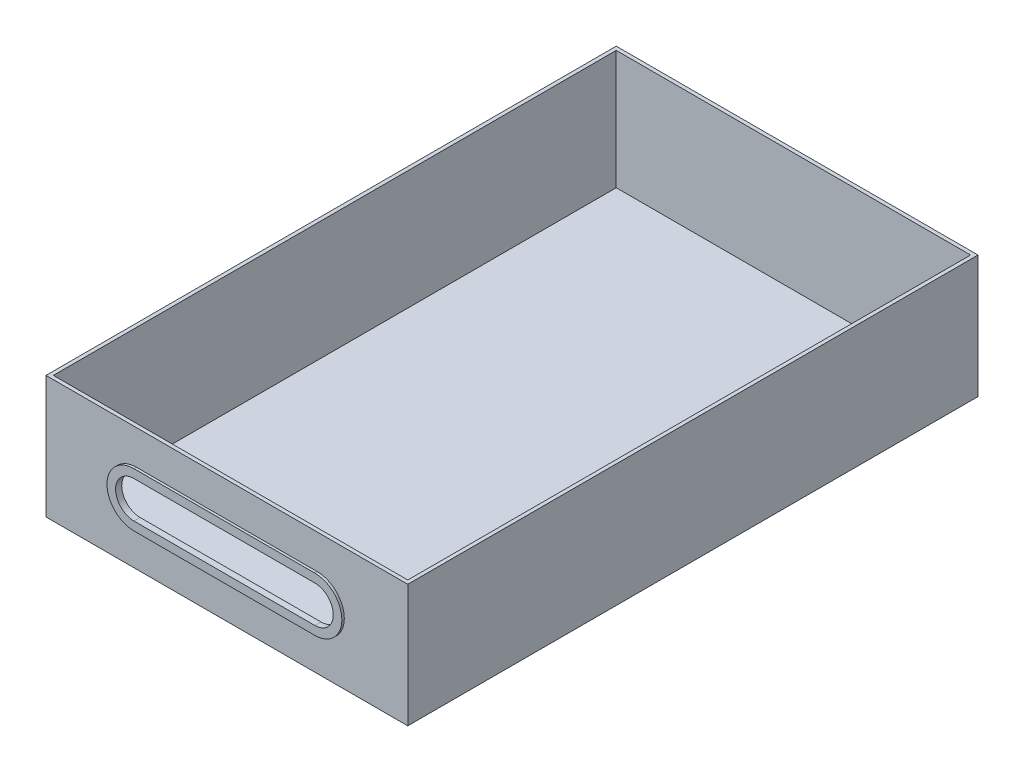
ISO-10303-21;
HEADER;
FILE_DESCRIPTION(('STEP AP214'),'2;1');
FILE_NAME('part.step','',(''),(''),'','','');
FILE_SCHEMA(('AUTOMOTIVE_DESIGN { 1 0 10303 214 1 1 1 1 }'));
ENDSEC;
DATA;
#1=APPLICATION_CONTEXT('core data for automotive mechanical design processes');
#2=APPLICATION_PROTOCOL_DEFINITION('international standard','automotive_design',2000,#1);
#3=PRODUCT_CONTEXT('',#1,'mechanical');
#4=PRODUCT('Part','Part','',(#3));
#5=PRODUCT_RELATED_PRODUCT_CATEGORY('part','',(#4));
#6=PRODUCT_DEFINITION_FORMATION('','',#4);
#7=PRODUCT_DEFINITION_CONTEXT('part definition',#1,'design');
#8=PRODUCT_DEFINITION('design','',#6,#7);
#9=PRODUCT_DEFINITION_SHAPE('','',#8);
#10=(LENGTH_UNIT() NAMED_UNIT(*) SI_UNIT(.MILLI.,.METRE.));
#11=(NAMED_UNIT(*) PLANE_ANGLE_UNIT() SI_UNIT($,.RADIAN.));
#12=(NAMED_UNIT(*) SI_UNIT($,.STERADIAN.) SOLID_ANGLE_UNIT());
#13=UNCERTAINTY_MEASURE_WITH_UNIT(LENGTH_MEASURE(1.E-05),#10,'distance_accuracy_value','');
#14=(GEOMETRIC_REPRESENTATION_CONTEXT(3) GLOBAL_UNCERTAINTY_ASSIGNED_CONTEXT((#13)) GLOBAL_UNIT_ASSIGNED_CONTEXT((#10,
#11,#12)) REPRESENTATION_CONTEXT('',''));
#15=CARTESIAN_POINT('',(0.,0.,0.));
#16=DIRECTION('',(0.,0.,1.));
#17=DIRECTION('',(1.,0.,0.));
#18=AXIS2_PLACEMENT_3D('',#15,#16,#17);
#19=CARTESIAN_POINT('',(147.5,-100.,-232.5));
#20=DIRECTION('',(0.,0.,-1.));
#21=DIRECTION('',(-1.,0.,0.));
#22=AXIS2_PLACEMENT_3D('',#19,#20,#21);
#23=PLANE('',#22);
#24=DIRECTION('',(-1.,0.,0.));
#25=VECTOR('',#24,1.);
#26=CARTESIAN_POINT('',(147.5,0.,-232.5));
#27=LINE('',#26,#25);
#28=CARTESIAN_POINT('',(147.5,0.,-232.5));
#29=VERTEX_POINT('',#28);
#30=CARTESIAN_POINT('',(-147.5,0.,-232.5));
#31=VERTEX_POINT('',#30);
#32=EDGE_CURVE('E263',#29,#31,#27,.T.);
#33=ORIENTED_EDGE('',*,*,#32,.F.);
#34=DIRECTION('',(0.,1.,0.));
#35=VECTOR('',#34,1.);
#36=CARTESIAN_POINT('',(147.5,-100.,-232.5));
#37=LINE('',#36,#35);
#38=CARTESIAN_POINT('',(147.5,-100.,-232.5));
#39=VERTEX_POINT('',#38);
#40=EDGE_CURVE('E336',#39,#29,#37,.T.);
#41=ORIENTED_EDGE('',*,*,#40,.F.);
#42=DIRECTION('',(-1.,0.,0.));
#43=VECTOR('',#42,1.);
#44=CARTESIAN_POINT('',(147.5,-100.,-232.5));
#45=LINE('',#44,#43);
#46=CARTESIAN_POINT('',(-147.5,-100.,-232.5));
#47=VERTEX_POINT('',#46);
#48=EDGE_CURVE('E304',#39,#47,#45,.T.);
#49=ORIENTED_EDGE('',*,*,#48,.T.);
#50=DIRECTION('',(0.,1.,0.));
#51=VECTOR('',#50,1.);
#52=CARTESIAN_POINT('',(-147.5,-100.,-232.5));
#53=LINE('',#52,#51);
#54=EDGE_CURVE('E321',#47,#31,#53,.T.);
#55=ORIENTED_EDGE('',*,*,#54,.T.);
#56=EDGE_LOOP('',(#33,#41,#49,#55));
#57=FACE_BOUND('',#56,.T.);
#58=ADVANCED_FACE('F69',(#57),#23,.T.);
#59=CARTESIAN_POINT('',(147.5,-100.,232.5));
#60=DIRECTION('',(1.,0.,0.));
#61=DIRECTION('',(0.,0.,-1.));
#62=AXIS2_PLACEMENT_3D('',#59,#60,#61);
#63=PLANE('',#62);
#64=DIRECTION('',(0.,0.,-1.));
#65=VECTOR('',#64,1.);
#66=CARTESIAN_POINT('',(147.5,0.,232.5));
#67=LINE('',#66,#65);
#68=CARTESIAN_POINT('',(147.5,0.,232.5));
#69=VERTEX_POINT('',#68);
#70=EDGE_CURVE('E309',#69,#29,#67,.T.);
#71=ORIENTED_EDGE('',*,*,#70,.F.);
#72=DIRECTION('',(0.,1.,0.));
#73=VECTOR('',#72,1.);
#74=CARTESIAN_POINT('',(147.5,-100.,232.5));
#75=LINE('',#74,#73);
#76=CARTESIAN_POINT('',(147.5,-100.,232.5));
#77=VERTEX_POINT('',#76);
#78=EDGE_CURVE('E340',#77,#69,#75,.T.);
#79=ORIENTED_EDGE('',*,*,#78,.F.);
#80=DIRECTION('',(0.,0.,-1.));
#81=VECTOR('',#80,1.);
#82=CARTESIAN_POINT('',(147.5,-100.,232.5));
#83=LINE('',#82,#81);
#84=EDGE_CURVE('E317',#77,#39,#83,.T.);
#85=ORIENTED_EDGE('',*,*,#84,.T.);
#86=ORIENTED_EDGE('',*,*,#40,.T.);
#87=EDGE_LOOP('',(#71,#79,#85,#86));
#88=FACE_BOUND('',#87,.T.);
#89=ADVANCED_FACE('F371',(#88),#63,.T.);
#90=CARTESIAN_POINT('',(-147.5,-100.,232.5));
#91=DIRECTION('',(0.,0.,1.));
#92=DIRECTION('',(1.,0.,0.));
#93=AXIS2_PLACEMENT_3D('',#90,#91,#92);
#94=PLANE('',#93);
#95=DIRECTION('',(1.,0.,0.));
#96=VECTOR('',#95,1.);
#97=CARTESIAN_POINT('',(-73.7500000000001,-28.,232.5));
#98=LINE('',#97,#96);
#99=CARTESIAN_POINT('',(-73.7500000000001,-28.,232.5));
#100=VERTEX_POINT('',#99);
#101=CARTESIAN_POINT('',(73.7499999999999,-28.,232.5));
#102=VERTEX_POINT('',#101);
#103=EDGE_CURVE('E215',#100,#102,#98,.T.);
#104=ORIENTED_EDGE('',*,*,#103,.T.);
#105=CARTESIAN_POINT('',(73.7499999999999,-50.,232.5));
#106=DIRECTION('',(0.,0.,1.));
#107=DIRECTION('',(1.,0.,0.));
#108=AXIS2_PLACEMENT_3D('',#105,#106,#107);
#109=CIRCLE('',#108,22.);
#110=CARTESIAN_POINT('',(73.7499999999999,-72.,232.5));
#111=VERTEX_POINT('',#110);
#112=EDGE_CURVE('E234',#111,#102,#109,.T.);
#113=ORIENTED_EDGE('',*,*,#112,.F.);
#114=DIRECTION('',(1.,0.,0.));
#115=VECTOR('',#114,1.);
#116=CARTESIAN_POINT('',(-73.7500000000001,-72.,232.5));
#117=LINE('',#116,#115);
#118=CARTESIAN_POINT('',(-73.7500000000001,-72.,232.5));
#119=VERTEX_POINT('',#118);
#120=EDGE_CURVE('E237',#119,#111,#117,.T.);
#121=ORIENTED_EDGE('',*,*,#120,.F.);
#122=CARTESIAN_POINT('',(-73.7500000000001,-50.,232.5));
#123=DIRECTION('',(0.,0.,1.));
#124=DIRECTION('',(1.,0.,0.));
#125=AXIS2_PLACEMENT_3D('',#122,#123,#124);
#126=CIRCLE('',#125,22.);
#127=EDGE_CURVE('E221',#100,#119,#126,.T.);
#128=ORIENTED_EDGE('',*,*,#127,.F.);
#129=EDGE_LOOP('',(#104,#113,#121,#128));
#130=FACE_BOUND('',#129,.T.);
#131=DIRECTION('',(1.,0.,0.));
#132=VECTOR('',#131,1.);
#133=CARTESIAN_POINT('',(-147.5,0.,232.5));
#134=LINE('',#133,#132);
#135=CARTESIAN_POINT('',(-147.5,0.,232.5));
#136=VERTEX_POINT('',#135);
#137=EDGE_CURVE('E329',#136,#69,#134,.T.);
#138=ORIENTED_EDGE('',*,*,#137,.F.);
#139=DIRECTION('',(0.,1.,0.));
#140=VECTOR('',#139,1.);
#141=CARTESIAN_POINT('',(-147.5,-100.,232.5));
#142=LINE('',#141,#140);
#143=CARTESIAN_POINT('',(-147.5,-100.,232.5));
#144=VERTEX_POINT('',#143);
#145=EDGE_CURVE('E343',#144,#136,#142,.T.);
#146=ORIENTED_EDGE('',*,*,#145,.F.);
#147=DIRECTION('',(1.,0.,0.));
#148=VECTOR('',#147,1.);
#149=CARTESIAN_POINT('',(-147.5,-100.,232.5));
#150=LINE('',#149,#148);
#151=EDGE_CURVE('E313',#144,#77,#150,.T.);
#152=ORIENTED_EDGE('',*,*,#151,.T.);
#153=ORIENTED_EDGE('',*,*,#78,.T.);
#154=EDGE_LOOP('',(#138,#146,#152,#153));
#155=FACE_BOUND('',#154,.T.);
#156=ADVANCED_FACE('F376',(#130,#155),#94,.T.);
#157=CARTESIAN_POINT('',(-147.5,-100.,-232.5));
#158=DIRECTION('',(-1.,0.,0.));
#159=DIRECTION('',(0.,0.,1.));
#160=AXIS2_PLACEMENT_3D('',#157,#158,#159);
#161=PLANE('',#160);
#162=DIRECTION('',(0.,0.,1.));
#163=VECTOR('',#162,1.);
#164=CARTESIAN_POINT('',(-147.5,0.,-232.5));
#165=LINE('',#164,#163);
#166=EDGE_CURVE('E325',#31,#136,#165,.T.);
#167=ORIENTED_EDGE('',*,*,#166,.F.);
#168=ORIENTED_EDGE('',*,*,#54,.F.);
#169=DIRECTION('',(0.,0.,1.));
#170=VECTOR('',#169,1.);
#171=CARTESIAN_POINT('',(-147.5,-100.,-232.5));
#172=LINE('',#171,#170);
#173=EDGE_CURVE('E308',#47,#144,#172,.T.);
#174=ORIENTED_EDGE('',*,*,#173,.T.);
#175=ORIENTED_EDGE('',*,*,#145,.T.);
#176=EDGE_LOOP('',(#167,#168,#174,#175));
#177=FACE_BOUND('',#176,.T.);
#178=ADVANCED_FACE('F392',(#177),#161,.T.);
#179=CARTESIAN_POINT('',(0.,-100.,0.));
#180=DIRECTION('',(0.,1.,0.));
#181=DIRECTION('',(0.,0.,1.));
#182=AXIS2_PLACEMENT_3D('',#179,#180,#181);
#183=PLANE('',#182);
#184=ORIENTED_EDGE('',*,*,#48,.F.);
#185=ORIENTED_EDGE('',*,*,#84,.F.);
#186=ORIENTED_EDGE('',*,*,#151,.F.);
#187=ORIENTED_EDGE('',*,*,#173,.F.);
#188=EDGE_LOOP('',(#184,#185,#186,#187));
#189=FACE_BOUND('',#188,.T.);
#190=ADVANCED_FACE('F389',(#189),#183,.F.);
#191=CARTESIAN_POINT('',(0.,0.,0.));
#192=DIRECTION('',(0.,1.,0.));
#193=DIRECTION('',(0.,0.,1.));
#194=AXIS2_PLACEMENT_3D('',#191,#192,#193);
#195=PLANE('',#194);
#196=DIRECTION('',(-1.,0.,0.));
#197=VECTOR('',#196,1.);
#198=CARTESIAN_POINT('',(0.,0.,-229.5));
#199=LINE('',#198,#197);
#200=CARTESIAN_POINT('',(144.5,0.,-229.5));
#201=VERTEX_POINT('',#200);
#202=CARTESIAN_POINT('',(-144.5,0.,-229.5));
#203=VERTEX_POINT('',#202);
#204=EDGE_CURVE('E259',#201,#203,#199,.T.);
#205=ORIENTED_EDGE('',*,*,#204,.F.);
#206=DIRECTION('',(0.,0.,-1.));
#207=VECTOR('',#206,1.);
#208=CARTESIAN_POINT('',(144.5,0.,0.));
#209=LINE('',#208,#207);
#210=CARTESIAN_POINT('',(144.5,0.,229.5));
#211=VERTEX_POINT('',#210);
#212=EDGE_CURVE('E270',#211,#201,#209,.T.);
#213=ORIENTED_EDGE('',*,*,#212,.F.);
#214=DIRECTION('',(1.,0.,0.));
#215=VECTOR('',#214,1.);
#216=CARTESIAN_POINT('',(0.,0.,229.5));
#217=LINE('',#216,#215);
#218=CARTESIAN_POINT('',(-144.5,0.,229.5));
#219=VERTEX_POINT('',#218);
#220=EDGE_CURVE('E298',#219,#211,#217,.T.);
#221=ORIENTED_EDGE('',*,*,#220,.F.);
#222=DIRECTION('',(0.,0.,1.));
#223=VECTOR('',#222,1.);
#224=CARTESIAN_POINT('',(-144.5,0.,0.));
#225=LINE('',#224,#223);
#226=EDGE_CURVE('E294',#203,#219,#225,.T.);
#227=ORIENTED_EDGE('',*,*,#226,.F.);
#228=EDGE_LOOP('',(#205,#213,#221,#227));
#229=FACE_BOUND('',#228,.T.);
#230=ORIENTED_EDGE('',*,*,#32,.T.);
#231=ORIENTED_EDGE('',*,*,#166,.T.);
#232=ORIENTED_EDGE('',*,*,#137,.T.);
#233=ORIENTED_EDGE('',*,*,#70,.T.);
#234=EDGE_LOOP('',(#230,#231,#232,#233));
#235=FACE_BOUND('',#234,.T.);
#236=ADVANCED_FACE('F384',(#229,#235),#195,.T.);
#237=CARTESIAN_POINT('',(147.5,-100.,-229.5));
#238=DIRECTION('',(0.,0.,-1.));
#239=DIRECTION('',(-1.,0.,0.));
#240=AXIS2_PLACEMENT_3D('',#237,#238,#239);
#241=PLANE('',#240);
#242=ORIENTED_EDGE('',*,*,#204,.T.);
#243=DIRECTION('',(0.,1.,0.));
#244=VECTOR('',#243,1.);
#245=CARTESIAN_POINT('',(-144.5,-100.,-229.5));
#246=LINE('',#245,#244);
#247=CARTESIAN_POINT('',(-144.5,-97.,-229.5));
#248=VERTEX_POINT('',#247);
#249=EDGE_CURVE('E271',#248,#203,#246,.T.);
#250=ORIENTED_EDGE('',*,*,#249,.F.);
#251=DIRECTION('',(-1.,0.,0.));
#252=VECTOR('',#251,1.);
#253=CARTESIAN_POINT('',(0.,-97.,-229.5));
#254=LINE('',#253,#252);
#255=CARTESIAN_POINT('',(144.5,-97.,-229.5));
#256=VERTEX_POINT('',#255);
#257=EDGE_CURVE('E265',#256,#248,#254,.T.);
#258=ORIENTED_EDGE('',*,*,#257,.F.);
#259=DIRECTION('',(0.,1.,0.));
#260=VECTOR('',#259,1.);
#261=CARTESIAN_POINT('',(144.5,-100.,-229.5));
#262=LINE('',#261,#260);
#263=EDGE_CURVE('E260',#256,#201,#262,.T.);
#264=ORIENTED_EDGE('',*,*,#263,.T.);
#265=EDGE_LOOP('',(#242,#250,#258,#264));
#266=FACE_BOUND('',#265,.T.);
#267=ADVANCED_FACE('F403',(#266),#241,.F.);
#268=CARTESIAN_POINT('',(144.5,-100.,232.5));
#269=DIRECTION('',(1.,0.,0.));
#270=DIRECTION('',(0.,0.,-1.));
#271=AXIS2_PLACEMENT_3D('',#268,#269,#270);
#272=PLANE('',#271);
#273=ORIENTED_EDGE('',*,*,#212,.T.);
#274=ORIENTED_EDGE('',*,*,#263,.F.);
#275=DIRECTION('',(0.,0.,-1.));
#276=VECTOR('',#275,1.);
#277=CARTESIAN_POINT('',(144.5,-97.,0.));
#278=LINE('',#277,#276);
#279=CARTESIAN_POINT('',(144.5,-97.,229.5));
#280=VERTEX_POINT('',#279);
#281=EDGE_CURVE('E275',#280,#256,#278,.T.);
#282=ORIENTED_EDGE('',*,*,#281,.F.);
#283=DIRECTION('',(0.,1.,0.));
#284=VECTOR('',#283,1.);
#285=CARTESIAN_POINT('',(144.5,-100.,229.5));
#286=LINE('',#285,#284);
#287=EDGE_CURVE('E264',#280,#211,#286,.T.);
#288=ORIENTED_EDGE('',*,*,#287,.T.);
#289=EDGE_LOOP('',(#273,#274,#282,#288));
#290=FACE_BOUND('',#289,.T.);
#291=ADVANCED_FACE('F417',(#290),#272,.F.);
#292=CARTESIAN_POINT('',(-147.5,-100.,229.5));
#293=DIRECTION('',(0.,0.,1.));
#294=DIRECTION('',(1.,0.,0.));
#295=AXIS2_PLACEMENT_3D('',#292,#293,#294);
#296=PLANE('',#295);
#297=CARTESIAN_POINT('',(-73.7500000000001,-50.,229.5));
#298=DIRECTION('',(0.,0.,1.));
#299=DIRECTION('',(1.,0.,0.));
#300=AXIS2_PLACEMENT_3D('',#297,#298,#299);
#301=CIRCLE('',#300,15.);
#302=CARTESIAN_POINT('',(-73.7500000000001,-35.,229.5));
#303=VERTEX_POINT('',#302);
#304=CARTESIAN_POINT('',(-73.7500000000001,-65.,229.5));
#305=VERTEX_POINT('',#304);
#306=EDGE_CURVE('E339',#303,#305,#301,.T.);
#307=ORIENTED_EDGE('',*,*,#306,.T.);
#308=DIRECTION('',(1.,0.,0.));
#309=VECTOR('',#308,1.);
#310=CARTESIAN_POINT('',(-147.5,-65.,229.5));
#311=LINE('',#310,#309);
#312=CARTESIAN_POINT('',(73.7499999999999,-65.,229.5));
#313=VERTEX_POINT('',#312);
#314=EDGE_CURVE('E12',#305,#313,#311,.T.);
#315=ORIENTED_EDGE('',*,*,#314,.T.);
#316=CARTESIAN_POINT('',(73.7499999999999,-50.,229.5));
#317=DIRECTION('',(0.,0.,1.));
#318=DIRECTION('',(1.,0.,0.));
#319=AXIS2_PLACEMENT_3D('',#316,#317,#318);
#320=CIRCLE('',#319,15.);
#321=CARTESIAN_POINT('',(73.7499999999999,-35.,229.5));
#322=VERTEX_POINT('',#321);
#323=EDGE_CURVE('E77',#313,#322,#320,.T.);
#324=ORIENTED_EDGE('',*,*,#323,.T.);
#325=DIRECTION('',(1.,0.,0.));
#326=VECTOR('',#325,1.);
#327=CARTESIAN_POINT('',(-147.5,-35.,229.5));
#328=LINE('',#327,#326);
#329=EDGE_CURVE('E351',#303,#322,#328,.T.);
#330=ORIENTED_EDGE('',*,*,#329,.F.);
#331=EDGE_LOOP('',(#307,#315,#324,#330));
#332=FACE_BOUND('',#331,.T.);
#333=ORIENTED_EDGE('',*,*,#220,.T.);
#334=ORIENTED_EDGE('',*,*,#287,.F.);
#335=DIRECTION('',(1.,0.,0.));
#336=VECTOR('',#335,1.);
#337=CARTESIAN_POINT('',(0.,-97.,229.5));
#338=LINE('',#337,#336);
#339=CARTESIAN_POINT('',(-144.5,-97.,229.5));
#340=VERTEX_POINT('',#339);
#341=EDGE_CURVE('E282',#340,#280,#338,.T.);
#342=ORIENTED_EDGE('',*,*,#341,.F.);
#343=DIRECTION('',(0.,1.,0.));
#344=VECTOR('',#343,1.);
#345=CARTESIAN_POINT('',(-144.5,-100.,229.5));
#346=LINE('',#345,#344);
#347=EDGE_CURVE('E274',#340,#219,#346,.T.);
#348=ORIENTED_EDGE('',*,*,#347,.T.);
#349=EDGE_LOOP('',(#333,#334,#342,#348));
#350=FACE_BOUND('',#349,.T.);
#351=ADVANCED_FACE('F356',(#332,#350),#296,.F.);
#352=CARTESIAN_POINT('',(-144.5,-100.,-232.5));
#353=DIRECTION('',(-1.,0.,0.));
#354=DIRECTION('',(0.,0.,1.));
#355=AXIS2_PLACEMENT_3D('',#352,#353,#354);
#356=PLANE('',#355);
#357=ORIENTED_EDGE('',*,*,#226,.T.);
#358=ORIENTED_EDGE('',*,*,#347,.F.);
#359=DIRECTION('',(0.,0.,1.));
#360=VECTOR('',#359,1.);
#361=CARTESIAN_POINT('',(-144.5,-97.,0.));
#362=LINE('',#361,#360);
#363=EDGE_CURVE('E269',#248,#340,#362,.T.);
#364=ORIENTED_EDGE('',*,*,#363,.F.);
#365=ORIENTED_EDGE('',*,*,#249,.T.);
#366=EDGE_LOOP('',(#357,#358,#364,#365));
#367=FACE_BOUND('',#366,.T.);
#368=ADVANCED_FACE('F410',(#367),#356,.F.);
#369=CARTESIAN_POINT('',(0.,-97.,0.));
#370=DIRECTION('',(0.,1.,0.));
#371=DIRECTION('',(0.,0.,1.));
#372=AXIS2_PLACEMENT_3D('',#369,#370,#371);
#373=PLANE('',#372);
#374=ORIENTED_EDGE('',*,*,#257,.T.);
#375=ORIENTED_EDGE('',*,*,#363,.T.);
#376=ORIENTED_EDGE('',*,*,#341,.T.);
#377=ORIENTED_EDGE('',*,*,#281,.T.);
#378=EDGE_LOOP('',(#374,#375,#376,#377));
#379=FACE_BOUND('',#378,.T.);
#380=ADVANCED_FACE('F407',(#379),#373,.T.);
#381=CARTESIAN_POINT('',(-73.7500000000001,-65.,-409.517360273947));
#382=DIRECTION('',(0.,-1.,0.));
#383=DIRECTION('',(0.,0.,-1.));
#384=AXIS2_PLACEMENT_3D('',#381,#382,#383);
#385=PLANE('',#384);
#386=DIRECTION('',(0.,0.,1.));
#387=VECTOR('',#386,1.);
#388=CARTESIAN_POINT('',(-73.7500000000001,-65.,-409.517360273947));
#389=LINE('',#388,#387);
#390=CARTESIAN_POINT('',(-73.7500000000001,-65.,234.5));
#391=VERTEX_POINT('',#390);
#392=EDGE_CURVE('E92',#305,#391,#389,.T.);
#393=ORIENTED_EDGE('',*,*,#392,.T.);
#394=DIRECTION('',(1.,0.,0.));
#395=VECTOR('',#394,1.);
#396=CARTESIAN_POINT('',(0.,-65.,234.5));
#397=LINE('',#396,#395);
#398=CARTESIAN_POINT('',(73.7499999999999,-65.,234.5));
#399=VERTEX_POINT('',#398);
#400=EDGE_CURVE('E198',#391,#399,#397,.T.);
#401=ORIENTED_EDGE('',*,*,#400,.T.);
#402=DIRECTION('',(0.,0.,1.));
#403=VECTOR('',#402,1.);
#404=CARTESIAN_POINT('',(73.7499999999999,-65.,-409.517360273947));
#405=LINE('',#404,#403);
#406=EDGE_CURVE('E184',#313,#399,#405,.T.);
#407=ORIENTED_EDGE('',*,*,#406,.F.);
#408=ORIENTED_EDGE('',*,*,#314,.F.);
#409=EDGE_LOOP('',(#393,#401,#407,#408));
#410=FACE_BOUND('',#409,.T.);
#411=ADVANCED_FACE('F199',(#410),#385,.F.);
#412=CARTESIAN_POINT('',(73.7499999999999,-50.,-409.517360273947));
#413=DIRECTION('',(0.,0.,1.));
#414=DIRECTION('',(1.,0.,0.));
#415=AXIS2_PLACEMENT_3D('',#412,#413,#414);
#416=CYLINDRICAL_SURFACE('',#415,15.);
#417=ORIENTED_EDGE('',*,*,#406,.T.);
#418=CARTESIAN_POINT('',(73.7499999999999,-50.,234.5));
#419=DIRECTION('',(0.,0.,1.));
#420=DIRECTION('',(1.,0.,0.));
#421=AXIS2_PLACEMENT_3D('',#418,#419,#420);
#422=CIRCLE('',#421,15.);
#423=CARTESIAN_POINT('',(73.7499999999999,-35.,234.5));
#424=VERTEX_POINT('',#423);
#425=EDGE_CURVE('E189',#399,#424,#422,.T.);
#426=ORIENTED_EDGE('',*,*,#425,.T.);
#427=DIRECTION('',(0.,0.,1.));
#428=VECTOR('',#427,1.);
#429=CARTESIAN_POINT('',(73.7499999999999,-35.,-409.517360273947));
#430=LINE('',#429,#428);
#431=EDGE_CURVE('E194',#322,#424,#430,.T.);
#432=ORIENTED_EDGE('',*,*,#431,.F.);
#433=ORIENTED_EDGE('',*,*,#323,.F.);
#434=EDGE_LOOP('',(#417,#426,#432,#433));
#435=FACE_BOUND('',#434,.T.);
#436=ADVANCED_FACE('F186',(#435),#416,.F.);
#437=CARTESIAN_POINT('',(-73.7500000000001,-35.,-409.517360273947));
#438=DIRECTION('',(0.,-1.,0.));
#439=DIRECTION('',(0.,0.,-1.));
#440=AXIS2_PLACEMENT_3D('',#437,#438,#439);
#441=PLANE('',#440);
#442=ORIENTED_EDGE('',*,*,#329,.T.);
#443=ORIENTED_EDGE('',*,*,#431,.T.);
#444=DIRECTION('',(1.,0.,0.));
#445=VECTOR('',#444,1.);
#446=CARTESIAN_POINT('',(0.,-35.,234.5));
#447=LINE('',#446,#445);
#448=CARTESIAN_POINT('',(-73.7500000000001,-35.,234.5));
#449=VERTEX_POINT('',#448);
#450=EDGE_CURVE('E206',#449,#424,#447,.T.);
#451=ORIENTED_EDGE('',*,*,#450,.F.);
#452=DIRECTION('',(0.,0.,1.));
#453=VECTOR('',#452,1.);
#454=CARTESIAN_POINT('',(-73.7500000000001,-35.,-409.517360273947));
#455=LINE('',#454,#453);
#456=EDGE_CURVE('E252',#303,#449,#455,.T.);
#457=ORIENTED_EDGE('',*,*,#456,.F.);
#458=EDGE_LOOP('',(#442,#443,#451,#457));
#459=FACE_BOUND('',#458,.T.);
#460=ADVANCED_FACE('F361',(#459),#441,.T.);
#461=CARTESIAN_POINT('',(-73.7500000000001,-50.,-409.517360273947));
#462=DIRECTION('',(0.,0.,1.));
#463=DIRECTION('',(1.,0.,0.));
#464=AXIS2_PLACEMENT_3D('',#461,#462,#463);
#465=CYLINDRICAL_SURFACE('',#464,15.);
#466=ORIENTED_EDGE('',*,*,#456,.T.);
#467=CARTESIAN_POINT('',(-73.7500000000001,-50.,234.5));
#468=DIRECTION('',(0.,0.,1.));
#469=DIRECTION('',(1.,0.,0.));
#470=AXIS2_PLACEMENT_3D('',#467,#468,#469);
#471=CIRCLE('',#470,15.);
#472=EDGE_CURVE('E210',#449,#391,#471,.T.);
#473=ORIENTED_EDGE('',*,*,#472,.T.);
#474=ORIENTED_EDGE('',*,*,#392,.F.);
#475=ORIENTED_EDGE('',*,*,#306,.F.);
#476=EDGE_LOOP('',(#466,#473,#474,#475));
#477=FACE_BOUND('',#476,.T.);
#478=ADVANCED_FACE('F359',(#477),#465,.F.);
#479=CARTESIAN_POINT('',(73.7499999999999,-50.,234.5));
#480=DIRECTION('',(0.,0.,1.));
#481=DIRECTION('',(1.,0.,0.));
#482=AXIS2_PLACEMENT_3D('',#479,#480,#481);
#483=PLANE('',#482);
#484=DIRECTION('',(1.,0.,0.));
#485=VECTOR('',#484,1.);
#486=CARTESIAN_POINT('',(-73.7500000000001,-28.,234.5));
#487=LINE('',#486,#485);
#488=CARTESIAN_POINT('',(-73.7500000000001,-28.,234.5));
#489=VERTEX_POINT('',#488);
#490=CARTESIAN_POINT('',(73.7499999999999,-28.,234.5));
#491=VERTEX_POINT('',#490);
#492=EDGE_CURVE('E216',#489,#491,#487,.T.);
#493=ORIENTED_EDGE('',*,*,#492,.F.);
#494=CARTESIAN_POINT('',(-73.7500000000001,-50.,234.5));
#495=DIRECTION('',(0.,0.,1.));
#496=DIRECTION('',(1.,0.,0.));
#497=AXIS2_PLACEMENT_3D('',#494,#495,#496);
#498=CIRCLE('',#497,22.);
#499=CARTESIAN_POINT('',(-73.7500000000001,-72.,234.5));
#500=VERTEX_POINT('',#499);
#501=EDGE_CURVE('E227',#489,#500,#498,.T.);
#502=ORIENTED_EDGE('',*,*,#501,.T.);
#503=DIRECTION('',(1.,0.,0.));
#504=VECTOR('',#503,1.);
#505=CARTESIAN_POINT('',(-73.7500000000001,-72.,234.5));
#506=LINE('',#505,#504);
#507=CARTESIAN_POINT('',(73.7499999999999,-72.,234.5));
#508=VERTEX_POINT('',#507);
#509=EDGE_CURVE('E224',#500,#508,#506,.T.);
#510=ORIENTED_EDGE('',*,*,#509,.T.);
#511=CARTESIAN_POINT('',(73.7499999999999,-50.,234.5));
#512=DIRECTION('',(0.,0.,1.));
#513=DIRECTION('',(1.,0.,0.));
#514=AXIS2_PLACEMENT_3D('',#511,#512,#513);
#515=CIRCLE('',#514,22.);
#516=EDGE_CURVE('E220',#508,#491,#515,.T.);
#517=ORIENTED_EDGE('',*,*,#516,.T.);
#518=EDGE_LOOP('',(#493,#502,#510,#517));
#519=FACE_BOUND('',#518,.T.);
#520=ORIENTED_EDGE('',*,*,#425,.F.);
#521=ORIENTED_EDGE('',*,*,#400,.F.);
#522=ORIENTED_EDGE('',*,*,#472,.F.);
#523=ORIENTED_EDGE('',*,*,#450,.T.);
#524=EDGE_LOOP('',(#520,#521,#522,#523));
#525=FACE_BOUND('',#524,.T.);
#526=ADVANCED_FACE('F204',(#519,#525),#483,.T.);
#527=CARTESIAN_POINT('',(-73.7500000000001,-28.,234.5));
#528=DIRECTION('',(0.,1.,0.));
#529=DIRECTION('',(0.,0.,1.));
#530=AXIS2_PLACEMENT_3D('',#527,#528,#529);
#531=PLANE('',#530);
#532=ORIENTED_EDGE('',*,*,#103,.F.);
#533=DIRECTION('',(0.,0.,-1.));
#534=VECTOR('',#533,1.);
#535=CARTESIAN_POINT('',(-73.7500000000001,-28.,234.5));
#536=LINE('',#535,#534);
#537=EDGE_CURVE('E195',#489,#100,#536,.T.);
#538=ORIENTED_EDGE('',*,*,#537,.F.);
#539=ORIENTED_EDGE('',*,*,#492,.T.);
#540=DIRECTION('',(0.,0.,-1.));
#541=VECTOR('',#540,1.);
#542=CARTESIAN_POINT('',(73.7499999999999,-28.,234.5));
#543=LINE('',#542,#541);
#544=EDGE_CURVE('E230',#491,#102,#543,.T.);
#545=ORIENTED_EDGE('',*,*,#544,.T.);
#546=EDGE_LOOP('',(#532,#538,#539,#545));
#547=FACE_BOUND('',#546,.T.);
#548=ADVANCED_FACE('F457',(#547),#531,.T.);
#549=CARTESIAN_POINT('',(-73.7500000000001,-50.,234.5));
#550=DIRECTION('',(0.,0.,-1.));
#551=DIRECTION('',(-1.,0.,0.));
#552=AXIS2_PLACEMENT_3D('',#549,#550,#551);
#553=CYLINDRICAL_SURFACE('',#552,22.);
#554=ORIENTED_EDGE('',*,*,#127,.T.);
#555=DIRECTION('',(0.,0.,-1.));
#556=VECTOR('',#555,1.);
#557=CARTESIAN_POINT('',(-73.7500000000001,-72.,234.5));
#558=LINE('',#557,#556);
#559=EDGE_CURVE('E244',#500,#119,#558,.T.);
#560=ORIENTED_EDGE('',*,*,#559,.F.);
#561=ORIENTED_EDGE('',*,*,#501,.F.);
#562=ORIENTED_EDGE('',*,*,#537,.T.);
#563=EDGE_LOOP('',(#554,#560,#561,#562));
#564=FACE_BOUND('',#563,.T.);
#565=ADVANCED_FACE('F470',(#564),#553,.T.);
#566=CARTESIAN_POINT('',(-73.7500000000001,-72.,234.5));
#567=DIRECTION('',(0.,1.,0.));
#568=DIRECTION('',(0.,0.,1.));
#569=AXIS2_PLACEMENT_3D('',#566,#567,#568);
#570=PLANE('',#569);
#571=ORIENTED_EDGE('',*,*,#120,.T.);
#572=DIRECTION('',(0.,0.,-1.));
#573=VECTOR('',#572,1.);
#574=CARTESIAN_POINT('',(73.7499999999999,-72.,234.5));
#575=LINE('',#574,#573);
#576=EDGE_CURVE('E84',#508,#111,#575,.T.);
#577=ORIENTED_EDGE('',*,*,#576,.F.);
#578=ORIENTED_EDGE('',*,*,#509,.F.);
#579=ORIENTED_EDGE('',*,*,#559,.T.);
#580=EDGE_LOOP('',(#571,#577,#578,#579));
#581=FACE_BOUND('',#580,.T.);
#582=ADVANCED_FACE('F481',(#581),#570,.F.);
#583=CARTESIAN_POINT('',(73.7499999999999,-50.,234.5));
#584=DIRECTION('',(0.,0.,-1.));
#585=DIRECTION('',(-1.,0.,0.));
#586=AXIS2_PLACEMENT_3D('',#583,#584,#585);
#587=CYLINDRICAL_SURFACE('',#586,22.);
#588=ORIENTED_EDGE('',*,*,#112,.T.);
#589=ORIENTED_EDGE('',*,*,#544,.F.);
#590=ORIENTED_EDGE('',*,*,#516,.F.);
#591=ORIENTED_EDGE('',*,*,#576,.T.);
#592=EDGE_LOOP('',(#588,#589,#590,#591));
#593=FACE_BOUND('',#592,.T.);
#594=ADVANCED_FACE('F492',(#593),#587,.T.);
#595=CLOSED_SHELL('',(#58,#89,#156,#178,#190,#236,#267,#291,#351,#368,#380,#411,#436,#460,#478,
#526,#548,#565,#582,#594));
#596=MANIFOLD_SOLID_BREP('B2',#595);
#597=ADVANCED_BREP_SHAPE_REPRESENTATION('',(#18,#596),#14);
#598=SHAPE_DEFINITION_REPRESENTATION(#9,#597);
ENDSEC;
END-ISO-10303-21;
